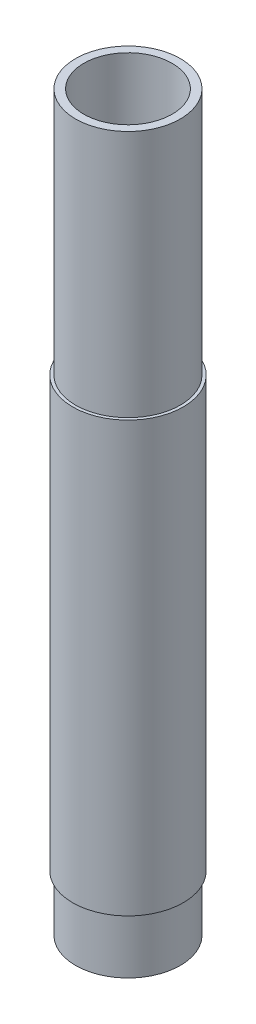
ISO-10303-21;
HEADER;
FILE_DESCRIPTION(('STEP AP214'),'2;1');
FILE_NAME('part.step','',(''),(''),'','','');
FILE_SCHEMA(('AUTOMOTIVE_DESIGN { 1 0 10303 214 1 1 1 1 }'));
ENDSEC;
DATA;
#1=APPLICATION_CONTEXT('core data for automotive mechanical design processes');
#2=APPLICATION_PROTOCOL_DEFINITION('international standard','automotive_design',2000,#1);
#3=PRODUCT_CONTEXT('',#1,'mechanical');
#4=PRODUCT('Part','Part','',(#3));
#5=PRODUCT_RELATED_PRODUCT_CATEGORY('part','',(#4));
#6=PRODUCT_DEFINITION_FORMATION('','',#4);
#7=PRODUCT_DEFINITION_CONTEXT('part definition',#1,'design');
#8=PRODUCT_DEFINITION('design','',#6,#7);
#9=PRODUCT_DEFINITION_SHAPE('','',#8);
#10=(LENGTH_UNIT() NAMED_UNIT(*) SI_UNIT(.MILLI.,.METRE.));
#11=(NAMED_UNIT(*) PLANE_ANGLE_UNIT() SI_UNIT($,.RADIAN.));
#12=(NAMED_UNIT(*) SI_UNIT($,.STERADIAN.) SOLID_ANGLE_UNIT());
#13=UNCERTAINTY_MEASURE_WITH_UNIT(LENGTH_MEASURE(1.E-05),#10,'distance_accuracy_value','');
#14=(GEOMETRIC_REPRESENTATION_CONTEXT(3) GLOBAL_UNCERTAINTY_ASSIGNED_CONTEXT((#13)) GLOBAL_UNIT_ASSIGNED_CONTEXT((#10,
#11,#12)) REPRESENTATION_CONTEXT('',''));
#15=CARTESIAN_POINT('',(0.,0.,0.));
#16=DIRECTION('',(0.,0.,1.));
#17=DIRECTION('',(1.,0.,0.));
#18=AXIS2_PLACEMENT_3D('',#15,#16,#17);
#19=CARTESIAN_POINT('',(0.,155.,0.));
#20=DIRECTION('',(0.,-1.,0.));
#21=DIRECTION('',(0.,0.,-1.));
#22=AXIS2_PLACEMENT_3D('',#19,#20,#21);
#23=CYLINDRICAL_SURFACE('',#22,15.);
#24=CARTESIAN_POINT('',(0.,0.,0.));
#25=DIRECTION('',(0.,1.,0.));
#26=DIRECTION('',(0.,0.,1.));
#27=AXIS2_PLACEMENT_3D('',#24,#25,#26);
#28=CIRCLE('',#27,15.);
#29=CARTESIAN_POINT('',(0.,0.,15.));
#30=VERTEX_POINT('',#29);
#31=EDGE_CURVE('E39',#30,#30,#28,.T.);
#32=ORIENTED_EDGE('',*,*,#31,.T.);
#33=EDGE_LOOP('',(#32));
#34=FACE_BOUND('',#33,.T.);
#35=CARTESIAN_POINT('',(0.,16.,0.));
#36=DIRECTION('',(0.,1.,0.));
#37=DIRECTION('',(0.,0.,1.));
#38=AXIS2_PLACEMENT_3D('',#35,#36,#37);
#39=CIRCLE('',#38,15.);
#40=CARTESIAN_POINT('',(0.,16.,15.));
#41=VERTEX_POINT('',#40);
#42=EDGE_CURVE('E10',#41,#41,#39,.T.);
#43=ORIENTED_EDGE('',*,*,#42,.F.);
#44=EDGE_LOOP('',(#43));
#45=FACE_BOUND('',#44,.T.);
#46=ADVANCED_FACE('F32',(#34,#45),#23,.T.);
#47=CARTESIAN_POINT('',(0.,0.,0.));
#48=DIRECTION('',(0.,1.,0.));
#49=DIRECTION('',(0.,0.,1.));
#50=AXIS2_PLACEMENT_3D('',#47,#48,#49);
#51=PLANE('',#50);
#52=CARTESIAN_POINT('',(0.,0.,0.));
#53=DIRECTION('',(0.,-1.,0.));
#54=DIRECTION('',(0.,0.,-1.));
#55=AXIS2_PLACEMENT_3D('',#52,#53,#54);
#56=CIRCLE('',#55,12.65);
#57=CARTESIAN_POINT('',(0.,0.,-12.65));
#58=VERTEX_POINT('',#57);
#59=EDGE_CURVE('E59',#58,#58,#56,.T.);
#60=ORIENTED_EDGE('',*,*,#59,.F.);
#61=EDGE_LOOP('',(#60));
#62=FACE_BOUND('',#61,.T.);
#63=ORIENTED_EDGE('',*,*,#31,.F.);
#64=EDGE_LOOP('',(#63));
#65=FACE_BOUND('',#64,.T.);
#66=ADVANCED_FACE('F74',(#62,#65),#51,.F.);
#67=CARTESIAN_POINT('',(0.,16.,0.));
#68=DIRECTION('',(0.,1.,0.));
#69=DIRECTION('',(0.,0.,1.));
#70=AXIS2_PLACEMENT_3D('',#67,#68,#69);
#71=CYLINDRICAL_SURFACE('',#70,15.85);
#72=CARTESIAN_POINT('',(0.,16.,0.));
#73=DIRECTION('',(0.,1.,0.));
#74=DIRECTION('',(0.,0.,1.));
#75=AXIS2_PLACEMENT_3D('',#72,#73,#74);
#76=CIRCLE('',#75,15.85);
#77=CARTESIAN_POINT('',(0.,16.,15.85));
#78=VERTEX_POINT('',#77);
#79=EDGE_CURVE('E48',#78,#78,#76,.T.);
#80=ORIENTED_EDGE('',*,*,#79,.T.);
#81=EDGE_LOOP('',(#80));
#82=FACE_BOUND('',#81,.T.);
#83=CARTESIAN_POINT('',(0.,139.,0.));
#84=DIRECTION('',(0.,1.,0.));
#85=DIRECTION('',(0.,0.,1.));
#86=AXIS2_PLACEMENT_3D('',#83,#84,#85);
#87=CIRCLE('',#86,15.85);
#88=CARTESIAN_POINT('',(0.,139.,15.85));
#89=VERTEX_POINT('',#88);
#90=EDGE_CURVE('E50',#89,#89,#87,.T.);
#91=ORIENTED_EDGE('',*,*,#90,.F.);
#92=EDGE_LOOP('',(#91));
#93=FACE_BOUND('',#92,.T.);
#94=ADVANCED_FACE('F77',(#82,#93),#71,.T.);
#95=CARTESIAN_POINT('',(0.,16.,0.));
#96=DIRECTION('',(0.,1.,0.));
#97=DIRECTION('',(0.,0.,1.));
#98=AXIS2_PLACEMENT_3D('',#95,#96,#97);
#99=PLANE('',#98);
#100=ORIENTED_EDGE('',*,*,#42,.T.);
#101=EDGE_LOOP('',(#100));
#102=FACE_BOUND('',#101,.T.);
#103=ORIENTED_EDGE('',*,*,#79,.F.);
#104=EDGE_LOOP('',(#103));
#105=FACE_BOUND('',#104,.T.);
#106=ADVANCED_FACE('F82',(#102,#105),#99,.F.);
#107=CARTESIAN_POINT('',(0.,139.,0.));
#108=DIRECTION('',(0.,1.,0.));
#109=DIRECTION('',(0.,0.,1.));
#110=AXIS2_PLACEMENT_3D('',#107,#108,#109);
#111=PLANE('',#110);
#112=CARTESIAN_POINT('',(0.,139.,0.));
#113=DIRECTION('',(0.,1.,0.));
#114=DIRECTION('',(0.,0.,1.));
#115=AXIS2_PLACEMENT_3D('',#112,#113,#114);
#116=CIRCLE('',#115,15.);
#117=CARTESIAN_POINT('',(0.,139.,15.));
#118=VERTEX_POINT('',#117);
#119=EDGE_CURVE('E43',#118,#118,#116,.T.);
#120=ORIENTED_EDGE('',*,*,#119,.F.);
#121=EDGE_LOOP('',(#120));
#122=FACE_BOUND('',#121,.T.);
#123=ORIENTED_EDGE('',*,*,#90,.T.);
#124=EDGE_LOOP('',(#123));
#125=FACE_BOUND('',#124,.T.);
#126=ADVANCED_FACE('F86',(#122,#125),#111,.T.);
#127=ORIENTED_EDGE('',*,*,#119,.T.);
#128=EDGE_LOOP('',(#127));
#129=FACE_BOUND('',#128,.T.);
#130=CARTESIAN_POINT('',(0.,210.,0.));
#131=DIRECTION('',(0.,1.,0.));
#132=DIRECTION('',(0.,0.,1.));
#133=AXIS2_PLACEMENT_3D('',#130,#131,#132);
#134=CIRCLE('',#133,15.);
#135=CARTESIAN_POINT('',(0.,210.,15.));
#136=VERTEX_POINT('',#135);
#137=EDGE_CURVE('E53',#136,#136,#134,.T.);
#138=ORIENTED_EDGE('',*,*,#137,.F.);
#139=EDGE_LOOP('',(#138));
#140=FACE_BOUND('',#139,.T.);
#141=ADVANCED_FACE('F34',(#129,#140),#23,.T.);
#142=CARTESIAN_POINT('',(0.,210.,0.));
#143=DIRECTION('',(0.,1.,0.));
#144=DIRECTION('',(0.,0.,1.));
#145=AXIS2_PLACEMENT_3D('',#142,#143,#144);
#146=PLANE('',#145);
#147=CARTESIAN_POINT('',(0.,210.,0.));
#148=DIRECTION('',(0.,-1.,0.));
#149=DIRECTION('',(0.,0.,-1.));
#150=AXIS2_PLACEMENT_3D('',#147,#148,#149);
#151=CIRCLE('',#150,12.65);
#152=CARTESIAN_POINT('',(0.,210.,-12.65));
#153=VERTEX_POINT('',#152);
#154=EDGE_CURVE('E58',#153,#153,#151,.T.);
#155=ORIENTED_EDGE('',*,*,#154,.T.);
#156=EDGE_LOOP('',(#155));
#157=FACE_BOUND('',#156,.T.);
#158=ORIENTED_EDGE('',*,*,#137,.T.);
#159=EDGE_LOOP('',(#158));
#160=FACE_BOUND('',#159,.T.);
#161=ADVANCED_FACE('F65',(#157,#160),#146,.T.);
#162=CARTESIAN_POINT('',(0.,210.,0.));
#163=DIRECTION('',(0.,-1.,0.));
#164=DIRECTION('',(0.,0.,-1.));
#165=AXIS2_PLACEMENT_3D('',#162,#163,#164);
#166=CYLINDRICAL_SURFACE('',#165,12.65);
#167=ORIENTED_EDGE('',*,*,#154,.F.);
#168=EDGE_LOOP('',(#167));
#169=FACE_BOUND('',#168,.T.);
#170=ORIENTED_EDGE('',*,*,#59,.T.);
#171=EDGE_LOOP('',(#170));
#172=FACE_BOUND('',#171,.T.);
#173=ADVANCED_FACE('F68',(#169,#172),#166,.F.);
#174=CLOSED_SHELL('',(#46,#66,#94,#106,#126,#141,#161,#173));
#175=MANIFOLD_SOLID_BREP('B2',#174);
#176=ADVANCED_BREP_SHAPE_REPRESENTATION('',(#18,#175),#14);
#177=SHAPE_DEFINITION_REPRESENTATION(#9,#176);
ENDSEC;
END-ISO-10303-21;
